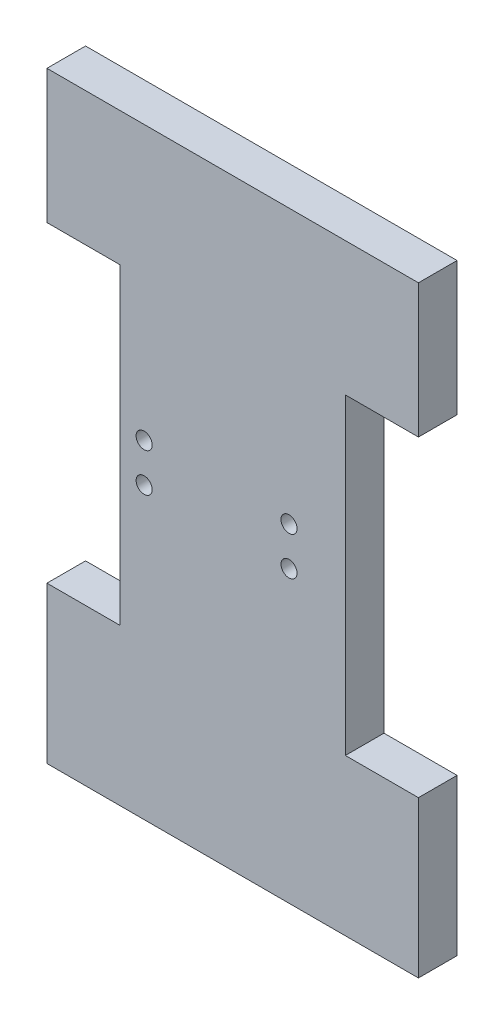
ISO-10303-21;
HEADER;
FILE_DESCRIPTION(('STEP AP214'),'2;1');
FILE_NAME('part.step','',(''),(''),'','','');
FILE_SCHEMA(('AUTOMOTIVE_DESIGN { 1 0 10303 214 1 1 1 1 }'));
ENDSEC;
DATA;
#1=APPLICATION_CONTEXT('core data for automotive mechanical design processes');
#2=APPLICATION_PROTOCOL_DEFINITION('international standard','automotive_design',2000,#1);
#3=PRODUCT_CONTEXT('',#1,'mechanical');
#4=PRODUCT('Part','Part','',(#3));
#5=PRODUCT_RELATED_PRODUCT_CATEGORY('part','',(#4));
#6=PRODUCT_DEFINITION_FORMATION('','',#4);
#7=PRODUCT_DEFINITION_CONTEXT('part definition',#1,'design');
#8=PRODUCT_DEFINITION('design','',#6,#7);
#9=PRODUCT_DEFINITION_SHAPE('','',#8);
#10=(LENGTH_UNIT() NAMED_UNIT(*) SI_UNIT(.MILLI.,.METRE.));
#11=(NAMED_UNIT(*) PLANE_ANGLE_UNIT() SI_UNIT($,.RADIAN.));
#12=(NAMED_UNIT(*) SI_UNIT($,.STERADIAN.) SOLID_ANGLE_UNIT());
#13=UNCERTAINTY_MEASURE_WITH_UNIT(LENGTH_MEASURE(1.E-05),#10,'distance_accuracy_value','');
#14=(GEOMETRIC_REPRESENTATION_CONTEXT(3) GLOBAL_UNCERTAINTY_ASSIGNED_CONTEXT((#13)) GLOBAL_UNIT_ASSIGNED_CONTEXT((#10,
#11,#12)) REPRESENTATION_CONTEXT('',''));
#15=CARTESIAN_POINT('',(0.,0.,0.));
#16=DIRECTION('',(0.,0.,1.));
#17=DIRECTION('',(1.,0.,0.));
#18=AXIS2_PLACEMENT_3D('',#15,#16,#17);
#19=CARTESIAN_POINT('',(57.7,90.,6.));
#20=DIRECTION('',(-1.,0.,0.));
#21=DIRECTION('',(0.,-1.,0.));
#22=AXIS2_PLACEMENT_3D('',#19,#20,#21);
#23=PLANE('',#22);
#24=DIRECTION('',(0.,1.,0.));
#25=VECTOR('',#24,1.);
#26=CARTESIAN_POINT('',(57.7,90.,-6.));
#27=LINE('',#26,#25);
#28=CARTESIAN_POINT('',(57.7,48.5,-6.));
#29=VERTEX_POINT('',#28);
#30=CARTESIAN_POINT('',(57.7,90.,-6.));
#31=VERTEX_POINT('',#30);
#32=EDGE_CURVE('E164',#29,#31,#27,.T.);
#33=ORIENTED_EDGE('',*,*,#32,.T.);
#34=DIRECTION('',(0.,0.,-1.));
#35=VECTOR('',#34,1.);
#36=CARTESIAN_POINT('',(57.7,90.,6.));
#37=LINE('',#36,#35);
#38=CARTESIAN_POINT('',(57.7,90.,6.));
#39=VERTEX_POINT('',#38);
#40=EDGE_CURVE('E11',#39,#31,#37,.T.);
#41=ORIENTED_EDGE('',*,*,#40,.F.);
#42=DIRECTION('',(0.,1.,0.));
#43=VECTOR('',#42,1.);
#44=CARTESIAN_POINT('',(57.7,90.,6.));
#45=LINE('',#44,#43);
#46=CARTESIAN_POINT('',(57.7,48.5,6.));
#47=VERTEX_POINT('',#46);
#48=EDGE_CURVE('E199',#47,#39,#45,.T.);
#49=ORIENTED_EDGE('',*,*,#48,.F.);
#50=DIRECTION('',(0.,0.,-1.));
#51=VECTOR('',#50,1.);
#52=CARTESIAN_POINT('',(57.7,48.5,6.));
#53=LINE('',#52,#51);
#54=EDGE_CURVE('E160',#47,#29,#53,.T.);
#55=ORIENTED_EDGE('',*,*,#54,.T.);
#56=EDGE_LOOP('',(#33,#41,#49,#55));
#57=FACE_BOUND('',#56,.T.);
#58=ADVANCED_FACE('F39',(#57),#23,.F.);
#59=CARTESIAN_POINT('',(-57.7,90.,6.));
#60=DIRECTION('',(0.,-1.,0.));
#61=DIRECTION('',(0.,0.,-1.));
#62=AXIS2_PLACEMENT_3D('',#59,#60,#61);
#63=PLANE('',#62);
#64=DIRECTION('',(-1.,0.,0.));
#65=VECTOR('',#64,1.);
#66=CARTESIAN_POINT('',(-57.7,90.,-6.));
#67=LINE('',#66,#65);
#68=CARTESIAN_POINT('',(-57.7,90.,-6.));
#69=VERTEX_POINT('',#68);
#70=EDGE_CURVE('E168',#31,#69,#67,.T.);
#71=ORIENTED_EDGE('',*,*,#70,.T.);
#72=DIRECTION('',(0.,0.,-1.));
#73=VECTOR('',#72,1.);
#74=CARTESIAN_POINT('',(-57.7,90.,6.));
#75=LINE('',#74,#73);
#76=CARTESIAN_POINT('',(-57.7,90.,6.));
#77=VERTEX_POINT('',#76);
#78=EDGE_CURVE('E48',#77,#69,#75,.T.);
#79=ORIENTED_EDGE('',*,*,#78,.F.);
#80=DIRECTION('',(-1.,0.,0.));
#81=VECTOR('',#80,1.);
#82=CARTESIAN_POINT('',(-57.7,90.,6.));
#83=LINE('',#82,#81);
#84=EDGE_CURVE('E111',#39,#77,#83,.T.);
#85=ORIENTED_EDGE('',*,*,#84,.F.);
#86=ORIENTED_EDGE('',*,*,#40,.T.);
#87=EDGE_LOOP('',(#71,#79,#85,#86));
#88=FACE_BOUND('',#87,.T.);
#89=ADVANCED_FACE('F294',(#88),#63,.F.);
#90=CARTESIAN_POINT('',(-57.7,90.,6.));
#91=DIRECTION('',(1.,0.,0.));
#92=DIRECTION('',(0.,1.,0.));
#93=AXIS2_PLACEMENT_3D('',#90,#91,#92);
#94=PLANE('',#93);
#95=DIRECTION('',(0.,-1.,0.));
#96=VECTOR('',#95,1.);
#97=CARTESIAN_POINT('',(-57.7,90.,-6.));
#98=LINE('',#97,#96);
#99=CARTESIAN_POINT('',(-57.7,48.5,-6.));
#100=VERTEX_POINT('',#99);
#101=EDGE_CURVE('E172',#69,#100,#98,.T.);
#102=ORIENTED_EDGE('',*,*,#101,.T.);
#103=DIRECTION('',(0.,0.,-1.));
#104=VECTOR('',#103,1.);
#105=CARTESIAN_POINT('',(-57.7,48.5,6.));
#106=LINE('',#105,#104);
#107=CARTESIAN_POINT('',(-57.7,48.5,6.));
#108=VERTEX_POINT('',#107);
#109=EDGE_CURVE('E226',#108,#100,#106,.T.);
#110=ORIENTED_EDGE('',*,*,#109,.F.);
#111=DIRECTION('',(0.,-1.,0.));
#112=VECTOR('',#111,1.);
#113=CARTESIAN_POINT('',(-57.7,90.,6.));
#114=LINE('',#113,#112);
#115=EDGE_CURVE('E236',#77,#108,#114,.T.);
#116=ORIENTED_EDGE('',*,*,#115,.F.);
#117=ORIENTED_EDGE('',*,*,#78,.T.);
#118=EDGE_LOOP('',(#102,#110,#116,#117));
#119=FACE_BOUND('',#118,.T.);
#120=ADVANCED_FACE('F234',(#119),#94,.F.);
#121=CARTESIAN_POINT('',(-57.7,48.5,6.));
#122=DIRECTION('',(0.,1.,0.));
#123=DIRECTION('',(0.,0.,1.));
#124=AXIS2_PLACEMENT_3D('',#121,#122,#123);
#125=PLANE('',#124);
#126=DIRECTION('',(1.,0.,0.));
#127=VECTOR('',#126,1.);
#128=CARTESIAN_POINT('',(-57.7,48.5,-6.));
#129=LINE('',#128,#127);
#130=CARTESIAN_POINT('',(-35.,48.5,-6.));
#131=VERTEX_POINT('',#130);
#132=EDGE_CURVE('E175',#100,#131,#129,.T.);
#133=ORIENTED_EDGE('',*,*,#132,.T.);
#134=DIRECTION('',(0.,0.,-1.));
#135=VECTOR('',#134,1.);
#136=CARTESIAN_POINT('',(-35.,48.5,6.));
#137=LINE('',#136,#135);
#138=CARTESIAN_POINT('',(-35.,48.5,6.));
#139=VERTEX_POINT('',#138);
#140=EDGE_CURVE('E222',#139,#131,#137,.T.);
#141=ORIENTED_EDGE('',*,*,#140,.F.);
#142=DIRECTION('',(1.,0.,0.));
#143=VECTOR('',#142,1.);
#144=CARTESIAN_POINT('',(-57.7,48.5,6.));
#145=LINE('',#144,#143);
#146=EDGE_CURVE('E255',#108,#139,#145,.T.);
#147=ORIENTED_EDGE('',*,*,#146,.F.);
#148=ORIENTED_EDGE('',*,*,#109,.T.);
#149=EDGE_LOOP('',(#133,#141,#147,#148));
#150=FACE_BOUND('',#149,.T.);
#151=ADVANCED_FACE('F245',(#150),#125,.F.);
#152=CARTESIAN_POINT('',(-35.,48.5,6.));
#153=DIRECTION('',(1.,0.,0.));
#154=DIRECTION('',(0.,0.,-1.));
#155=AXIS2_PLACEMENT_3D('',#152,#153,#154);
#156=PLANE('',#155);
#157=DIRECTION('',(0.,-1.,0.));
#158=VECTOR('',#157,1.);
#159=CARTESIAN_POINT('',(-35.,48.5,-6.));
#160=LINE('',#159,#158);
#161=CARTESIAN_POINT('',(-35.,-48.5,-6.));
#162=VERTEX_POINT('',#161);
#163=EDGE_CURVE('E178',#131,#162,#160,.T.);
#164=ORIENTED_EDGE('',*,*,#163,.T.);
#165=DIRECTION('',(0.,0.,-1.));
#166=VECTOR('',#165,1.);
#167=CARTESIAN_POINT('',(-35.,-48.5,6.));
#168=LINE('',#167,#166);
#169=CARTESIAN_POINT('',(-35.,-48.5,6.));
#170=VERTEX_POINT('',#169);
#171=EDGE_CURVE('E218',#170,#162,#168,.T.);
#172=ORIENTED_EDGE('',*,*,#171,.F.);
#173=DIRECTION('',(0.,-1.,0.));
#174=VECTOR('',#173,1.);
#175=CARTESIAN_POINT('',(-35.,48.5,6.));
#176=LINE('',#175,#174);
#177=EDGE_CURVE('E251',#139,#170,#176,.T.);
#178=ORIENTED_EDGE('',*,*,#177,.F.);
#179=ORIENTED_EDGE('',*,*,#140,.T.);
#180=EDGE_LOOP('',(#164,#172,#178,#179));
#181=FACE_BOUND('',#180,.T.);
#182=ADVANCED_FACE('F249',(#181),#156,.F.);
#183=CARTESIAN_POINT('',(-35.,-48.5,6.));
#184=DIRECTION('',(0.,-1.,0.));
#185=DIRECTION('',(0.,0.,-1.));
#186=AXIS2_PLACEMENT_3D('',#183,#184,#185);
#187=PLANE('',#186);
#188=DIRECTION('',(-1.,0.,0.));
#189=VECTOR('',#188,1.);
#190=CARTESIAN_POINT('',(-35.,-48.5,-6.));
#191=LINE('',#190,#189);
#192=CARTESIAN_POINT('',(-57.7,-48.5,-6.));
#193=VERTEX_POINT('',#192);
#194=EDGE_CURVE('E181',#162,#193,#191,.T.);
#195=ORIENTED_EDGE('',*,*,#194,.T.);
#196=DIRECTION('',(0.,0.,-1.));
#197=VECTOR('',#196,1.);
#198=CARTESIAN_POINT('',(-57.7,-48.5,6.));
#199=LINE('',#198,#197);
#200=CARTESIAN_POINT('',(-57.7,-48.5,6.));
#201=VERTEX_POINT('',#200);
#202=EDGE_CURVE('E214',#201,#193,#199,.T.);
#203=ORIENTED_EDGE('',*,*,#202,.F.);
#204=DIRECTION('',(-1.,0.,0.));
#205=VECTOR('',#204,1.);
#206=CARTESIAN_POINT('',(-35.,-48.5,6.));
#207=LINE('',#206,#205);
#208=EDGE_CURVE('E254',#170,#201,#207,.T.);
#209=ORIENTED_EDGE('',*,*,#208,.F.);
#210=ORIENTED_EDGE('',*,*,#171,.T.);
#211=EDGE_LOOP('',(#195,#203,#209,#210));
#212=FACE_BOUND('',#211,.T.);
#213=ADVANCED_FACE('F307',(#212),#187,.F.);
#214=CARTESIAN_POINT('',(-57.7,-48.5,6.));
#215=DIRECTION('',(1.,0.,0.));
#216=DIRECTION('',(0.,1.,0.));
#217=AXIS2_PLACEMENT_3D('',#214,#215,#216);
#218=PLANE('',#217);
#219=DIRECTION('',(0.,-1.,0.));
#220=VECTOR('',#219,1.);
#221=CARTESIAN_POINT('',(-57.7,-48.5,-6.));
#222=LINE('',#221,#220);
#223=CARTESIAN_POINT('',(-57.7,-97.0125,-6.));
#224=VERTEX_POINT('',#223);
#225=EDGE_CURVE('E184',#193,#224,#222,.T.);
#226=ORIENTED_EDGE('',*,*,#225,.T.);
#227=DIRECTION('',(0.,0.,-1.));
#228=VECTOR('',#227,1.);
#229=CARTESIAN_POINT('',(-57.7,-97.0125,6.));
#230=LINE('',#229,#228);
#231=CARTESIAN_POINT('',(-57.7,-97.0125,6.));
#232=VERTEX_POINT('',#231);
#233=EDGE_CURVE('E210',#232,#224,#230,.T.);
#234=ORIENTED_EDGE('',*,*,#233,.F.);
#235=DIRECTION('',(0.,-1.,0.));
#236=VECTOR('',#235,1.);
#237=CARTESIAN_POINT('',(-57.7,-48.5,6.));
#238=LINE('',#237,#236);
#239=EDGE_CURVE('E259',#201,#232,#238,.T.);
#240=ORIENTED_EDGE('',*,*,#239,.F.);
#241=ORIENTED_EDGE('',*,*,#202,.T.);
#242=EDGE_LOOP('',(#226,#234,#240,#241));
#243=FACE_BOUND('',#242,.T.);
#244=ADVANCED_FACE('F310',(#243),#218,.F.);
#245=CARTESIAN_POINT('',(57.7,-97.0125,6.));
#246=DIRECTION('',(0.,1.,0.));
#247=DIRECTION('',(0.,0.,1.));
#248=AXIS2_PLACEMENT_3D('',#245,#246,#247);
#249=PLANE('',#248);
#250=DIRECTION('',(1.,0.,0.));
#251=VECTOR('',#250,1.);
#252=CARTESIAN_POINT('',(57.7,-97.0125,-6.));
#253=LINE('',#252,#251);
#254=CARTESIAN_POINT('',(57.7,-97.0125,-6.));
#255=VERTEX_POINT('',#254);
#256=EDGE_CURVE('E187',#224,#255,#253,.T.);
#257=ORIENTED_EDGE('',*,*,#256,.T.);
#258=DIRECTION('',(0.,0.,-1.));
#259=VECTOR('',#258,1.);
#260=CARTESIAN_POINT('',(57.7,-97.0125,6.));
#261=LINE('',#260,#259);
#262=CARTESIAN_POINT('',(57.7,-97.0125,6.));
#263=VERTEX_POINT('',#262);
#264=EDGE_CURVE('E206',#263,#255,#261,.T.);
#265=ORIENTED_EDGE('',*,*,#264,.F.);
#266=DIRECTION('',(1.,0.,0.));
#267=VECTOR('',#266,1.);
#268=CARTESIAN_POINT('',(57.7,-97.0125,6.));
#269=LINE('',#268,#267);
#270=EDGE_CURVE('E266',#232,#263,#269,.T.);
#271=ORIENTED_EDGE('',*,*,#270,.F.);
#272=ORIENTED_EDGE('',*,*,#233,.T.);
#273=EDGE_LOOP('',(#257,#265,#271,#272));
#274=FACE_BOUND('',#273,.T.);
#275=ADVANCED_FACE('F274',(#274),#249,.F.);
#276=CARTESIAN_POINT('',(57.7,-48.5,6.));
#277=DIRECTION('',(-1.,0.,0.));
#278=DIRECTION('',(0.,-1.,0.));
#279=AXIS2_PLACEMENT_3D('',#276,#277,#278);
#280=PLANE('',#279);
#281=DIRECTION('',(0.,1.,0.));
#282=VECTOR('',#281,1.);
#283=CARTESIAN_POINT('',(57.7,-48.5,-6.));
#284=LINE('',#283,#282);
#285=CARTESIAN_POINT('',(57.7,-48.5,-6.));
#286=VERTEX_POINT('',#285);
#287=EDGE_CURVE('E190',#255,#286,#284,.T.);
#288=ORIENTED_EDGE('',*,*,#287,.T.);
#289=DIRECTION('',(0.,0.,-1.));
#290=VECTOR('',#289,1.);
#291=CARTESIAN_POINT('',(57.7,-48.5,6.));
#292=LINE('',#291,#290);
#293=CARTESIAN_POINT('',(57.7,-48.5,6.));
#294=VERTEX_POINT('',#293);
#295=EDGE_CURVE('E153',#294,#286,#292,.T.);
#296=ORIENTED_EDGE('',*,*,#295,.F.);
#297=DIRECTION('',(0.,1.,0.));
#298=VECTOR('',#297,1.);
#299=CARTESIAN_POINT('',(57.7,-48.5,6.));
#300=LINE('',#299,#298);
#301=EDGE_CURVE('E142',#263,#294,#300,.T.);
#302=ORIENTED_EDGE('',*,*,#301,.F.);
#303=ORIENTED_EDGE('',*,*,#264,.T.);
#304=EDGE_LOOP('',(#288,#296,#302,#303));
#305=FACE_BOUND('',#304,.T.);
#306=ADVANCED_FACE('F278',(#305),#280,.F.);
#307=CARTESIAN_POINT('',(35.,-48.5,6.));
#308=DIRECTION('',(0.,-1.,0.));
#309=DIRECTION('',(0.,0.,-1.));
#310=AXIS2_PLACEMENT_3D('',#307,#308,#309);
#311=PLANE('',#310);
#312=DIRECTION('',(-1.,0.,0.));
#313=VECTOR('',#312,1.);
#314=CARTESIAN_POINT('',(35.,-48.5,-6.));
#315=LINE('',#314,#313);
#316=CARTESIAN_POINT('',(35.,-48.5,-6.));
#317=VERTEX_POINT('',#316);
#318=EDGE_CURVE('E151',#286,#317,#315,.T.);
#319=ORIENTED_EDGE('',*,*,#318,.T.);
#320=DIRECTION('',(0.,0.,-1.));
#321=VECTOR('',#320,1.);
#322=CARTESIAN_POINT('',(35.,-48.5,6.));
#323=LINE('',#322,#321);
#324=CARTESIAN_POINT('',(35.,-48.5,6.));
#325=VERTEX_POINT('',#324);
#326=EDGE_CURVE('E148',#325,#317,#323,.T.);
#327=ORIENTED_EDGE('',*,*,#326,.F.);
#328=DIRECTION('',(-1.,0.,0.));
#329=VECTOR('',#328,1.);
#330=CARTESIAN_POINT('',(35.,-48.5,6.));
#331=LINE('',#330,#329);
#332=EDGE_CURVE('E136',#294,#325,#331,.T.);
#333=ORIENTED_EDGE('',*,*,#332,.F.);
#334=ORIENTED_EDGE('',*,*,#295,.T.);
#335=EDGE_LOOP('',(#319,#327,#333,#334));
#336=FACE_BOUND('',#335,.T.);
#337=ADVANCED_FACE('F149',(#336),#311,.F.);
#338=CARTESIAN_POINT('',(35.,48.5,6.));
#339=DIRECTION('',(-1.,0.,0.));
#340=DIRECTION('',(0.,0.,1.));
#341=AXIS2_PLACEMENT_3D('',#338,#339,#340);
#342=PLANE('',#341);
#343=DIRECTION('',(0.,1.,0.));
#344=VECTOR('',#343,1.);
#345=CARTESIAN_POINT('',(35.,48.5,-6.));
#346=LINE('',#345,#344);
#347=CARTESIAN_POINT('',(35.,48.5,-6.));
#348=VERTEX_POINT('',#347);
#349=EDGE_CURVE('E97',#317,#348,#346,.T.);
#350=ORIENTED_EDGE('',*,*,#349,.T.);
#351=DIRECTION('',(0.,0.,-1.));
#352=VECTOR('',#351,1.);
#353=CARTESIAN_POINT('',(35.,48.5,6.));
#354=LINE('',#353,#352);
#355=CARTESIAN_POINT('',(35.,48.5,6.));
#356=VERTEX_POINT('',#355);
#357=EDGE_CURVE('E154',#356,#348,#354,.T.);
#358=ORIENTED_EDGE('',*,*,#357,.F.);
#359=DIRECTION('',(0.,1.,0.));
#360=VECTOR('',#359,1.);
#361=CARTESIAN_POINT('',(35.,48.5,6.));
#362=LINE('',#361,#360);
#363=EDGE_CURVE('E140',#325,#356,#362,.T.);
#364=ORIENTED_EDGE('',*,*,#363,.F.);
#365=ORIENTED_EDGE('',*,*,#326,.T.);
#366=EDGE_LOOP('',(#350,#358,#364,#365));
#367=FACE_BOUND('',#366,.T.);
#368=ADVANCED_FACE('F156',(#367),#342,.F.);
#369=CARTESIAN_POINT('',(57.7,48.5,6.));
#370=DIRECTION('',(0.,1.,0.));
#371=DIRECTION('',(0.,0.,1.));
#372=AXIS2_PLACEMENT_3D('',#369,#370,#371);
#373=PLANE('',#372);
#374=DIRECTION('',(1.,0.,0.));
#375=VECTOR('',#374,1.);
#376=CARTESIAN_POINT('',(57.7,48.5,-6.));
#377=LINE('',#376,#375);
#378=EDGE_CURVE('E103',#348,#29,#377,.T.);
#379=ORIENTED_EDGE('',*,*,#378,.T.);
#380=ORIENTED_EDGE('',*,*,#54,.F.);
#381=DIRECTION('',(1.,0.,0.));
#382=VECTOR('',#381,1.);
#383=CARTESIAN_POINT('',(57.7,48.5,6.));
#384=LINE('',#383,#382);
#385=EDGE_CURVE('E56',#356,#47,#384,.T.);
#386=ORIENTED_EDGE('',*,*,#385,.F.);
#387=ORIENTED_EDGE('',*,*,#357,.T.);
#388=EDGE_LOOP('',(#379,#380,#386,#387));
#389=FACE_BOUND('',#388,.T.);
#390=ADVANCED_FACE('F282',(#389),#373,.F.);
#391=CARTESIAN_POINT('',(0.,0.,6.));
#392=DIRECTION('',(0.,0.,-1.));
#393=DIRECTION('',(-1.,0.,0.));
#394=AXIS2_PLACEMENT_3D('',#391,#392,#393);
#395=PLANE('',#394);
#396=CARTESIAN_POINT('',(17.5,5.00000000000095,6.));
#397=DIRECTION('',(0.,0.,-1.));
#398=DIRECTION('',(-1.,0.,0.));
#399=AXIS2_PLACEMENT_3D('',#396,#397,#398);
#400=CIRCLE('',#399,2.49999999999999);
#401=CARTESIAN_POINT('',(15.,5.00000000000095,6.));
#402=VERTEX_POINT('',#401);
#403=EDGE_CURVE('E393',#402,#402,#400,.T.);
#404=ORIENTED_EDGE('',*,*,#403,.T.);
#405=EDGE_LOOP('',(#404));
#406=FACE_BOUND('',#405,.T.);
#407=CARTESIAN_POINT('',(-27.5,5.00000000000095,6.));
#408=DIRECTION('',(0.,0.,-1.));
#409=DIRECTION('',(-1.,0.,0.));
#410=AXIS2_PLACEMENT_3D('',#407,#408,#409);
#411=CIRCLE('',#410,2.49999999999999);
#412=CARTESIAN_POINT('',(-30.,5.00000000000095,6.));
#413=VERTEX_POINT('',#412);
#414=EDGE_CURVE('E406',#413,#413,#411,.T.);
#415=ORIENTED_EDGE('',*,*,#414,.T.);
#416=EDGE_LOOP('',(#415));
#417=FACE_BOUND('',#416,.T.);
#418=CARTESIAN_POINT('',(-27.5,-6.99999999999905,6.));
#419=DIRECTION('',(0.,0.,-1.));
#420=DIRECTION('',(-1.,0.,0.));
#421=AXIS2_PLACEMENT_3D('',#418,#419,#420);
#422=CIRCLE('',#421,2.49999999999999);
#423=CARTESIAN_POINT('',(-30.,-6.99999999999905,6.));
#424=VERTEX_POINT('',#423);
#425=EDGE_CURVE('E414',#424,#424,#422,.T.);
#426=ORIENTED_EDGE('',*,*,#425,.T.);
#427=EDGE_LOOP('',(#426));
#428=FACE_BOUND('',#427,.T.);
#429=CARTESIAN_POINT('',(17.5,-6.99999999999905,6.));
#430=DIRECTION('',(0.,0.,-1.));
#431=DIRECTION('',(-1.,0.,0.));
#432=AXIS2_PLACEMENT_3D('',#429,#430,#431);
#433=CIRCLE('',#432,2.49999999999999);
#434=CARTESIAN_POINT('',(15.,-6.99999999999905,6.));
#435=VERTEX_POINT('',#434);
#436=EDGE_CURVE('E169',#435,#435,#433,.T.);
#437=ORIENTED_EDGE('',*,*,#436,.T.);
#438=EDGE_LOOP('',(#437));
#439=FACE_BOUND('',#438,.T.);
#440=ORIENTED_EDGE('',*,*,#48,.T.);
#441=ORIENTED_EDGE('',*,*,#84,.T.);
#442=ORIENTED_EDGE('',*,*,#115,.T.);
#443=ORIENTED_EDGE('',*,*,#146,.T.);
#444=ORIENTED_EDGE('',*,*,#177,.T.);
#445=ORIENTED_EDGE('',*,*,#208,.T.);
#446=ORIENTED_EDGE('',*,*,#239,.T.);
#447=ORIENTED_EDGE('',*,*,#270,.T.);
#448=ORIENTED_EDGE('',*,*,#301,.T.);
#449=ORIENTED_EDGE('',*,*,#332,.T.);
#450=ORIENTED_EDGE('',*,*,#363,.T.);
#451=ORIENTED_EDGE('',*,*,#385,.T.);
#452=EDGE_LOOP('',(#440,#441,#442,#443,#444,#445,#446,#447,#448,#449,#450,#451));
#453=FACE_BOUND('',#452,.T.);
#454=ADVANCED_FACE('F138',(#406,#417,#428,#439,#453),#395,.F.);
#455=CARTESIAN_POINT('',(0.,0.,-6.));
#456=DIRECTION('',(0.,0.,-1.));
#457=DIRECTION('',(-1.,0.,0.));
#458=AXIS2_PLACEMENT_3D('',#455,#456,#457);
#459=PLANE('',#458);
#460=CARTESIAN_POINT('',(17.5,5.00000000000095,-6.));
#461=DIRECTION('',(0.,0.,-1.));
#462=DIRECTION('',(-1.,0.,0.));
#463=AXIS2_PLACEMENT_3D('',#460,#461,#462);
#464=CIRCLE('',#463,2.49999999999999);
#465=CARTESIAN_POINT('',(15.,5.00000000000095,-6.));
#466=VERTEX_POINT('',#465);
#467=EDGE_CURVE('E396',#466,#466,#464,.T.);
#468=ORIENTED_EDGE('',*,*,#467,.F.);
#469=EDGE_LOOP('',(#468));
#470=FACE_BOUND('',#469,.T.);
#471=CARTESIAN_POINT('',(-27.5,5.00000000000095,-6.));
#472=DIRECTION('',(0.,0.,-1.));
#473=DIRECTION('',(-1.,0.,0.));
#474=AXIS2_PLACEMENT_3D('',#471,#472,#473);
#475=CIRCLE('',#474,2.49999999999999);
#476=CARTESIAN_POINT('',(-30.,5.00000000000095,-6.));
#477=VERTEX_POINT('',#476);
#478=EDGE_CURVE('E400',#477,#477,#475,.T.);
#479=ORIENTED_EDGE('',*,*,#478,.F.);
#480=EDGE_LOOP('',(#479));
#481=FACE_BOUND('',#480,.T.);
#482=CARTESIAN_POINT('',(-27.5,-6.99999999999905,-6.));
#483=DIRECTION('',(0.,0.,-1.));
#484=DIRECTION('',(-1.,0.,0.));
#485=AXIS2_PLACEMENT_3D('',#482,#483,#484);
#486=CIRCLE('',#485,2.49999999999999);
#487=CARTESIAN_POINT('',(-30.,-6.99999999999905,-6.));
#488=VERTEX_POINT('',#487);
#489=EDGE_CURVE('E410',#488,#488,#486,.T.);
#490=ORIENTED_EDGE('',*,*,#489,.F.);
#491=EDGE_LOOP('',(#490));
#492=FACE_BOUND('',#491,.T.);
#493=CARTESIAN_POINT('',(17.5,-6.99999999999905,-6.));
#494=DIRECTION('',(0.,0.,-1.));
#495=DIRECTION('',(-1.,0.,0.));
#496=AXIS2_PLACEMENT_3D('',#493,#494,#495);
#497=CIRCLE('',#496,2.49999999999999);
#498=CARTESIAN_POINT('',(15.,-6.99999999999905,-6.));
#499=VERTEX_POINT('',#498);
#500=EDGE_CURVE('E418',#499,#499,#497,.T.);
#501=ORIENTED_EDGE('',*,*,#500,.F.);
#502=EDGE_LOOP('',(#501));
#503=FACE_BOUND('',#502,.T.);
#504=ORIENTED_EDGE('',*,*,#32,.F.);
#505=ORIENTED_EDGE('',*,*,#378,.F.);
#506=ORIENTED_EDGE('',*,*,#349,.F.);
#507=ORIENTED_EDGE('',*,*,#318,.F.);
#508=ORIENTED_EDGE('',*,*,#287,.F.);
#509=ORIENTED_EDGE('',*,*,#256,.F.);
#510=ORIENTED_EDGE('',*,*,#225,.F.);
#511=ORIENTED_EDGE('',*,*,#194,.F.);
#512=ORIENTED_EDGE('',*,*,#163,.F.);
#513=ORIENTED_EDGE('',*,*,#132,.F.);
#514=ORIENTED_EDGE('',*,*,#101,.F.);
#515=ORIENTED_EDGE('',*,*,#70,.F.);
#516=EDGE_LOOP('',(#504,#505,#506,#507,#508,#509,#510,#511,#512,#513,#514,#515));
#517=FACE_BOUND('',#516,.T.);
#518=ADVANCED_FACE('F240',(#470,#481,#492,#503,#517),#459,.T.);
#519=CARTESIAN_POINT('',(17.5,-6.99999999999905,-6.));
#520=DIRECTION('',(0.,0.,-1.));
#521=DIRECTION('',(-1.,0.,0.));
#522=AXIS2_PLACEMENT_3D('',#519,#520,#521);
#523=CYLINDRICAL_SURFACE('',#522,2.49999999999999);
#524=ORIENTED_EDGE('',*,*,#436,.F.);
#525=EDGE_LOOP('',(#524));
#526=FACE_BOUND('',#525,.T.);
#527=ORIENTED_EDGE('',*,*,#500,.T.);
#528=EDGE_LOOP('',(#527));
#529=FACE_BOUND('',#528,.T.);
#530=ADVANCED_FACE('F347',(#526,#529),#523,.F.);
#531=CARTESIAN_POINT('',(-27.5,-6.99999999999905,-6.));
#532=DIRECTION('',(0.,0.,-1.));
#533=DIRECTION('',(-1.,0.,0.));
#534=AXIS2_PLACEMENT_3D('',#531,#532,#533);
#535=CYLINDRICAL_SURFACE('',#534,2.49999999999999);
#536=ORIENTED_EDGE('',*,*,#425,.F.);
#537=EDGE_LOOP('',(#536));
#538=FACE_BOUND('',#537,.T.);
#539=ORIENTED_EDGE('',*,*,#489,.T.);
#540=EDGE_LOOP('',(#539));
#541=FACE_BOUND('',#540,.T.);
#542=ADVANCED_FACE('F356',(#538,#541),#535,.F.);
#543=CARTESIAN_POINT('',(-27.5,5.00000000000095,-6.));
#544=DIRECTION('',(0.,0.,-1.));
#545=DIRECTION('',(-1.,0.,0.));
#546=AXIS2_PLACEMENT_3D('',#543,#544,#545);
#547=CYLINDRICAL_SURFACE('',#546,2.49999999999999);
#548=ORIENTED_EDGE('',*,*,#414,.F.);
#549=EDGE_LOOP('',(#548));
#550=FACE_BOUND('',#549,.T.);
#551=ORIENTED_EDGE('',*,*,#478,.T.);
#552=EDGE_LOOP('',(#551));
#553=FACE_BOUND('',#552,.T.);
#554=ADVANCED_FACE('F366',(#550,#553),#547,.F.);
#555=CARTESIAN_POINT('',(17.5,5.00000000000095,-6.));
#556=DIRECTION('',(0.,0.,-1.));
#557=DIRECTION('',(-1.,0.,0.));
#558=AXIS2_PLACEMENT_3D('',#555,#556,#557);
#559=CYLINDRICAL_SURFACE('',#558,2.49999999999999);
#560=ORIENTED_EDGE('',*,*,#403,.F.);
#561=EDGE_LOOP('',(#560));
#562=FACE_BOUND('',#561,.T.);
#563=ORIENTED_EDGE('',*,*,#467,.T.);
#564=EDGE_LOOP('',(#563));
#565=FACE_BOUND('',#564,.T.);
#566=ADVANCED_FACE('F376',(#562,#565),#559,.F.);
#567=CLOSED_SHELL('',(#58,#89,#120,#151,#182,#213,#244,#275,#306,#337,#368,#390,#454,#518,#530,
#542,#554,#566));
#568=MANIFOLD_SOLID_BREP('B2',#567);
#569=ADVANCED_BREP_SHAPE_REPRESENTATION('',(#18,#568),#14);
#570=SHAPE_DEFINITION_REPRESENTATION(#9,#569);
ENDSEC;
END-ISO-10303-21;
